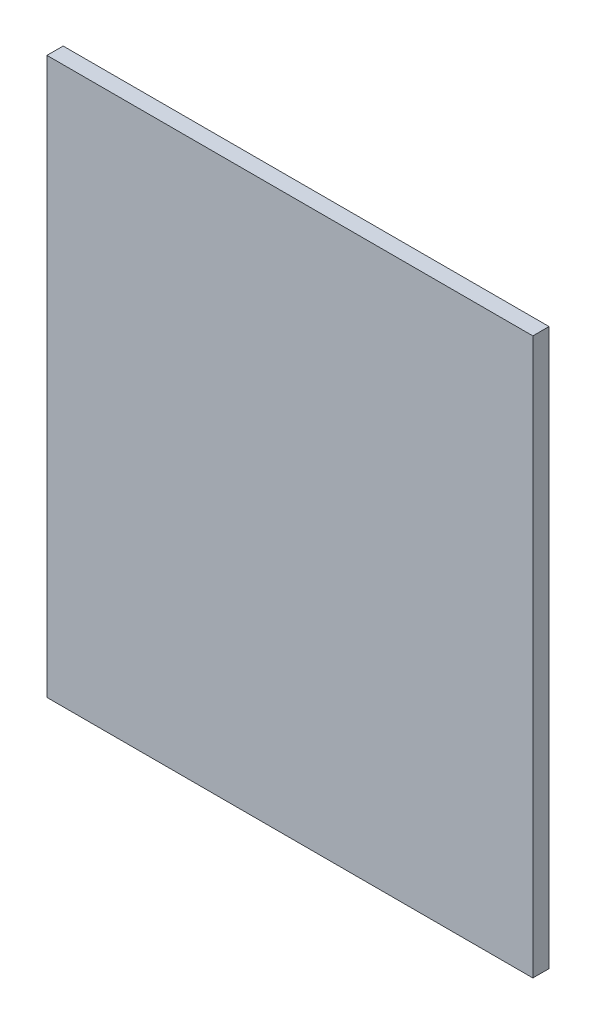
ISO-10303-21;
HEADER;
FILE_DESCRIPTION(('STEP AP214'),'2;1');
FILE_NAME('part.step','',(''),(''),'','','');
FILE_SCHEMA(('AUTOMOTIVE_DESIGN { 1 0 10303 214 1 1 1 1 }'));
ENDSEC;
DATA;
#1=APPLICATION_CONTEXT('core data for automotive mechanical design processes');
#2=APPLICATION_PROTOCOL_DEFINITION('international standard','automotive_design',2000,#1);
#3=PRODUCT_CONTEXT('',#1,'mechanical');
#4=PRODUCT('Part','Part','',(#3));
#5=PRODUCT_RELATED_PRODUCT_CATEGORY('part','',(#4));
#6=PRODUCT_DEFINITION_FORMATION('','',#4);
#7=PRODUCT_DEFINITION_CONTEXT('part definition',#1,'design');
#8=PRODUCT_DEFINITION('design','',#6,#7);
#9=PRODUCT_DEFINITION_SHAPE('','',#8);
#10=(LENGTH_UNIT() NAMED_UNIT(*) SI_UNIT(.MILLI.,.METRE.));
#11=(NAMED_UNIT(*) PLANE_ANGLE_UNIT() SI_UNIT($,.RADIAN.));
#12=(NAMED_UNIT(*) SI_UNIT($,.STERADIAN.) SOLID_ANGLE_UNIT());
#13=UNCERTAINTY_MEASURE_WITH_UNIT(LENGTH_MEASURE(1.E-05),#10,'distance_accuracy_value','');
#14=(GEOMETRIC_REPRESENTATION_CONTEXT(3) GLOBAL_UNCERTAINTY_ASSIGNED_CONTEXT((#13)) GLOBAL_UNIT_ASSIGNED_CONTEXT((#10,
#11,#12)) REPRESENTATION_CONTEXT('',''));
#15=CARTESIAN_POINT('',(0.,0.,0.));
#16=DIRECTION('',(0.,0.,1.));
#17=DIRECTION('',(1.,0.,0.));
#18=AXIS2_PLACEMENT_3D('',#15,#16,#17);
#19=CARTESIAN_POINT('',(0.,0.,6.));
#20=DIRECTION('',(-1.,0.,0.));
#21=DIRECTION('',(0.,-1.,0.));
#22=AXIS2_PLACEMENT_3D('',#19,#20,#21);
#23=PLANE('',#22);
#24=DIRECTION('',(0.,1.,0.));
#25=VECTOR('',#24,1.);
#26=CARTESIAN_POINT('',(0.,0.,0.));
#27=LINE('',#26,#25);
#28=CARTESIAN_POINT('',(0.,0.,0.));
#29=VERTEX_POINT('',#28);
#30=CARTESIAN_POINT('',(0.,206.,0.));
#31=VERTEX_POINT('',#30);
#32=EDGE_CURVE('E96',#29,#31,#27,.T.);
#33=ORIENTED_EDGE('',*,*,#32,.T.);
#34=DIRECTION('',(0.,0.,-1.));
#35=VECTOR('',#34,1.);
#36=CARTESIAN_POINT('',(0.,206.,6.));
#37=LINE('',#36,#35);
#38=CARTESIAN_POINT('',(0.,206.,6.));
#39=VERTEX_POINT('',#38);
#40=EDGE_CURVE('E11',#39,#31,#37,.T.);
#41=ORIENTED_EDGE('',*,*,#40,.F.);
#42=DIRECTION('',(0.,1.,0.));
#43=VECTOR('',#42,1.);
#44=CARTESIAN_POINT('',(0.,0.,6.));
#45=LINE('',#44,#43);
#46=CARTESIAN_POINT('',(0.,0.,6.));
#47=VERTEX_POINT('',#46);
#48=EDGE_CURVE('E84',#47,#39,#45,.T.);
#49=ORIENTED_EDGE('',*,*,#48,.F.);
#50=DIRECTION('',(0.,0.,-1.));
#51=VECTOR('',#50,1.);
#52=CARTESIAN_POINT('',(0.,0.,6.));
#53=LINE('',#52,#51);
#54=EDGE_CURVE('E92',#47,#29,#53,.T.);
#55=ORIENTED_EDGE('',*,*,#54,.T.);
#56=EDGE_LOOP('',(#33,#41,#49,#55));
#57=FACE_BOUND('',#56,.T.);
#58=ADVANCED_FACE('F33',(#57),#23,.F.);
#59=CARTESIAN_POINT('',(0.,206.,6.));
#60=DIRECTION('',(0.,-1.,0.));
#61=DIRECTION('',(1.,0.,0.));
#62=AXIS2_PLACEMENT_3D('',#59,#60,#61);
#63=PLANE('',#62);
#64=DIRECTION('',(-1.,0.,0.));
#65=VECTOR('',#64,1.);
#66=CARTESIAN_POINT('',(0.,206.,0.));
#67=LINE('',#66,#65);
#68=CARTESIAN_POINT('',(-180.,206.,0.));
#69=VERTEX_POINT('',#68);
#70=EDGE_CURVE('E88',#31,#69,#67,.T.);
#71=ORIENTED_EDGE('',*,*,#70,.T.);
#72=DIRECTION('',(0.,0.,-1.));
#73=VECTOR('',#72,1.);
#74=CARTESIAN_POINT('',(-180.,206.,6.));
#75=LINE('',#74,#73);
#76=CARTESIAN_POINT('',(-180.,206.,6.));
#77=VERTEX_POINT('',#76);
#78=EDGE_CURVE('E41',#77,#69,#75,.T.);
#79=ORIENTED_EDGE('',*,*,#78,.F.);
#80=DIRECTION('',(-1.,0.,0.));
#81=VECTOR('',#80,1.);
#82=CARTESIAN_POINT('',(0.,206.,6.));
#83=LINE('',#82,#81);
#84=EDGE_CURVE('E79',#39,#77,#83,.T.);
#85=ORIENTED_EDGE('',*,*,#84,.F.);
#86=ORIENTED_EDGE('',*,*,#40,.T.);
#87=EDGE_LOOP('',(#71,#79,#85,#86));
#88=FACE_BOUND('',#87,.T.);
#89=ADVANCED_FACE('F87',(#88),#63,.F.);
#90=CARTESIAN_POINT('',(-180.,0.,6.));
#91=DIRECTION('',(1.,0.,0.));
#92=DIRECTION('',(0.,0.,-1.));
#93=AXIS2_PLACEMENT_3D('',#90,#91,#92);
#94=PLANE('',#93);
#95=DIRECTION('',(0.,-1.,0.));
#96=VECTOR('',#95,1.);
#97=CARTESIAN_POINT('',(-180.,0.,0.));
#98=LINE('',#97,#96);
#99=CARTESIAN_POINT('',(-180.,0.,0.));
#100=VERTEX_POINT('',#99);
#101=EDGE_CURVE('E66',#69,#100,#98,.T.);
#102=ORIENTED_EDGE('',*,*,#101,.T.);
#103=DIRECTION('',(0.,0.,-1.));
#104=VECTOR('',#103,1.);
#105=CARTESIAN_POINT('',(-180.,0.,6.));
#106=LINE('',#105,#104);
#107=CARTESIAN_POINT('',(-180.,0.,6.));
#108=VERTEX_POINT('',#107);
#109=EDGE_CURVE('E89',#108,#100,#106,.T.);
#110=ORIENTED_EDGE('',*,*,#109,.F.);
#111=DIRECTION('',(0.,-1.,0.));
#112=VECTOR('',#111,1.);
#113=CARTESIAN_POINT('',(-180.,0.,6.));
#114=LINE('',#113,#112);
#115=EDGE_CURVE('E82',#77,#108,#114,.T.);
#116=ORIENTED_EDGE('',*,*,#115,.F.);
#117=ORIENTED_EDGE('',*,*,#78,.T.);
#118=EDGE_LOOP('',(#102,#110,#116,#117));
#119=FACE_BOUND('',#118,.T.);
#120=ADVANCED_FACE('F90',(#119),#94,.F.);
#121=CARTESIAN_POINT('',(0.,0.,6.));
#122=DIRECTION('',(0.,1.,0.));
#123=DIRECTION('',(-1.,0.,0.));
#124=AXIS2_PLACEMENT_3D('',#121,#122,#123);
#125=PLANE('',#124);
#126=DIRECTION('',(1.,0.,0.));
#127=VECTOR('',#126,1.);
#128=CARTESIAN_POINT('',(0.,0.,0.));
#129=LINE('',#128,#127);
#130=EDGE_CURVE('E72',#100,#29,#129,.T.);
#131=ORIENTED_EDGE('',*,*,#130,.T.);
#132=ORIENTED_EDGE('',*,*,#54,.F.);
#133=DIRECTION('',(1.,0.,0.));
#134=VECTOR('',#133,1.);
#135=CARTESIAN_POINT('',(0.,0.,6.));
#136=LINE('',#135,#134);
#137=EDGE_CURVE('E49',#108,#47,#136,.T.);
#138=ORIENTED_EDGE('',*,*,#137,.F.);
#139=ORIENTED_EDGE('',*,*,#109,.T.);
#140=EDGE_LOOP('',(#131,#132,#138,#139));
#141=FACE_BOUND('',#140,.T.);
#142=ADVANCED_FACE('F103',(#141),#125,.F.);
#143=CARTESIAN_POINT('',(0.,0.,6.));
#144=DIRECTION('',(0.,0.,1.));
#145=DIRECTION('',(1.,0.,0.));
#146=AXIS2_PLACEMENT_3D('',#143,#144,#145);
#147=PLANE('',#146);
#148=ORIENTED_EDGE('',*,*,#48,.T.);
#149=ORIENTED_EDGE('',*,*,#84,.T.);
#150=ORIENTED_EDGE('',*,*,#115,.T.);
#151=ORIENTED_EDGE('',*,*,#137,.T.);
#152=EDGE_LOOP('',(#148,#149,#150,#151));
#153=FACE_BOUND('',#152,.T.);
#154=ADVANCED_FACE('F80',(#153),#147,.T.);
#155=CARTESIAN_POINT('',(0.,0.,0.));
#156=DIRECTION('',(0.,0.,1.));
#157=DIRECTION('',(1.,0.,0.));
#158=AXIS2_PLACEMENT_3D('',#155,#156,#157);
#159=PLANE('',#158);
#160=ORIENTED_EDGE('',*,*,#32,.F.);
#161=ORIENTED_EDGE('',*,*,#130,.F.);
#162=ORIENTED_EDGE('',*,*,#101,.F.);
#163=ORIENTED_EDGE('',*,*,#70,.F.);
#164=EDGE_LOOP('',(#160,#161,#162,#163));
#165=FACE_BOUND('',#164,.T.);
#166=ADVANCED_FACE('F106',(#165),#159,.F.);
#167=CLOSED_SHELL('',(#58,#89,#120,#142,#154,#166));
#168=MANIFOLD_SOLID_BREP('B2',#167);
#169=ADVANCED_BREP_SHAPE_REPRESENTATION('',(#18,#168),#14);
#170=SHAPE_DEFINITION_REPRESENTATION(#9,#169);
ENDSEC;
END-ISO-10303-21;
